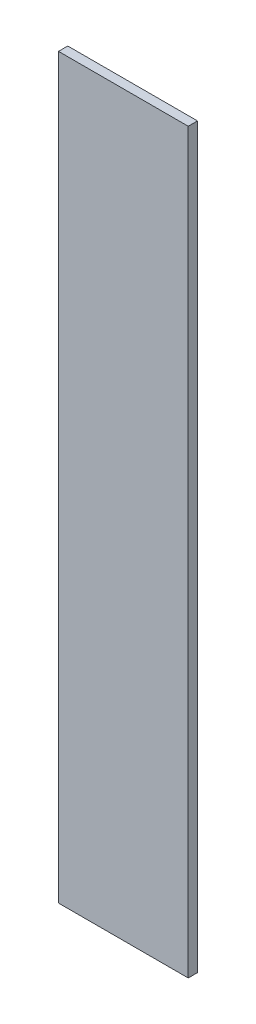
ISO-10303-21;
HEADER;
FILE_DESCRIPTION(('STEP AP214'),'2;1');
FILE_NAME('part.step','',(''),(''),'','','');
FILE_SCHEMA(('AUTOMOTIVE_DESIGN { 1 0 10303 214 1 1 1 1 }'));
ENDSEC;
DATA;
#1=APPLICATION_CONTEXT('core data for automotive mechanical design processes');
#2=APPLICATION_PROTOCOL_DEFINITION('international standard','automotive_design',2000,#1);
#3=PRODUCT_CONTEXT('',#1,'mechanical');
#4=PRODUCT('Part','Part','',(#3));
#5=PRODUCT_RELATED_PRODUCT_CATEGORY('part','',(#4));
#6=PRODUCT_DEFINITION_FORMATION('','',#4);
#7=PRODUCT_DEFINITION_CONTEXT('part definition',#1,'design');
#8=PRODUCT_DEFINITION('design','',#6,#7);
#9=PRODUCT_DEFINITION_SHAPE('','',#8);
#10=(LENGTH_UNIT() NAMED_UNIT(*) SI_UNIT(.MILLI.,.METRE.));
#11=(NAMED_UNIT(*) PLANE_ANGLE_UNIT() SI_UNIT($,.RADIAN.));
#12=(NAMED_UNIT(*) SI_UNIT($,.STERADIAN.) SOLID_ANGLE_UNIT());
#13=UNCERTAINTY_MEASURE_WITH_UNIT(LENGTH_MEASURE(1.E-05),#10,'distance_accuracy_value','');
#14=(GEOMETRIC_REPRESENTATION_CONTEXT(3) GLOBAL_UNCERTAINTY_ASSIGNED_CONTEXT((#13)) GLOBAL_UNIT_ASSIGNED_CONTEXT((#10,
#11,#12)) REPRESENTATION_CONTEXT('',''));
#15=CARTESIAN_POINT('',(0.,0.,0.));
#16=DIRECTION('',(0.,0.,1.));
#17=DIRECTION('',(1.,0.,0.));
#18=AXIS2_PLACEMENT_3D('',#15,#16,#17);
#19=CARTESIAN_POINT('',(0.,0.,6.35));
#20=DIRECTION('',(0.,1.,0.));
#21=DIRECTION('',(0.,0.,1.));
#22=AXIS2_PLACEMENT_3D('',#19,#20,#21);
#23=PLANE('',#22);
#24=DIRECTION('',(1.,0.,0.));
#25=VECTOR('',#24,1.);
#26=CARTESIAN_POINT('',(0.,0.,0.));
#27=LINE('',#26,#25);
#28=CARTESIAN_POINT('',(-88.9,0.,0.));
#29=VERTEX_POINT('',#28);
#30=CARTESIAN_POINT('',(0.,0.,0.));
#31=VERTEX_POINT('',#30);
#32=EDGE_CURVE('E113',#29,#31,#27,.T.);
#33=ORIENTED_EDGE('',*,*,#32,.T.);
#34=DIRECTION('',(0.,0.,-1.));
#35=VECTOR('',#34,1.);
#36=CARTESIAN_POINT('',(0.,0.,6.35));
#37=LINE('',#36,#35);
#38=CARTESIAN_POINT('',(0.,0.,6.35));
#39=VERTEX_POINT('',#38);
#40=EDGE_CURVE('E11',#39,#31,#37,.T.);
#41=ORIENTED_EDGE('',*,*,#40,.F.);
#42=DIRECTION('',(1.,0.,0.));
#43=VECTOR('',#42,1.);
#44=CARTESIAN_POINT('',(0.,0.,6.35));
#45=LINE('',#44,#43);
#46=CARTESIAN_POINT('',(-88.9,0.,6.35));
#47=VERTEX_POINT('',#46);
#48=EDGE_CURVE('E97',#47,#39,#45,.T.);
#49=ORIENTED_EDGE('',*,*,#48,.F.);
#50=DIRECTION('',(0.,0.,-1.));
#51=VECTOR('',#50,1.);
#52=CARTESIAN_POINT('',(-88.9,0.,6.35));
#53=LINE('',#52,#51);
#54=EDGE_CURVE('E109',#47,#29,#53,.T.);
#55=ORIENTED_EDGE('',*,*,#54,.T.);
#56=EDGE_LOOP('',(#33,#41,#49,#55));
#57=FACE_BOUND('',#56,.T.);
#58=ADVANCED_FACE('F45',(#57),#23,.F.);
#59=CARTESIAN_POINT('',(0.,0.,6.35));
#60=DIRECTION('',(-1.,0.,0.));
#61=DIRECTION('',(0.,0.,1.));
#62=AXIS2_PLACEMENT_3D('',#59,#60,#61);
#63=PLANE('',#62);
#64=DIRECTION('',(0.,1.,0.));
#65=VECTOR('',#64,1.);
#66=CARTESIAN_POINT('',(0.,0.,0.));
#67=LINE('',#66,#65);
#68=CARTESIAN_POINT('',(0.,505.46,0.));
#69=VERTEX_POINT('',#68);
#70=EDGE_CURVE('E102',#31,#69,#67,.T.);
#71=ORIENTED_EDGE('',*,*,#70,.T.);
#72=DIRECTION('',(0.,0.,-1.));
#73=VECTOR('',#72,1.);
#74=CARTESIAN_POINT('',(0.,505.46,6.35));
#75=LINE('',#74,#73);
#76=CARTESIAN_POINT('',(0.,505.46,6.35));
#77=VERTEX_POINT('',#76);
#78=EDGE_CURVE('E54',#77,#69,#75,.T.);
#79=ORIENTED_EDGE('',*,*,#78,.F.);
#80=DIRECTION('',(0.,1.,0.));
#81=VECTOR('',#80,1.);
#82=CARTESIAN_POINT('',(0.,0.,6.35));
#83=LINE('',#82,#81);
#84=EDGE_CURVE('E92',#39,#77,#83,.T.);
#85=ORIENTED_EDGE('',*,*,#84,.F.);
#86=ORIENTED_EDGE('',*,*,#40,.T.);
#87=EDGE_LOOP('',(#71,#79,#85,#86));
#88=FACE_BOUND('',#87,.T.);
#89=ADVANCED_FACE('F101',(#88),#63,.F.);
#90=CARTESIAN_POINT('',(0.,505.46,6.35));
#91=DIRECTION('',(0.,-1.,0.));
#92=DIRECTION('',(0.,0.,-1.));
#93=AXIS2_PLACEMENT_3D('',#90,#91,#92);
#94=PLANE('',#93);
#95=DIRECTION('',(-1.,0.,0.));
#96=VECTOR('',#95,1.);
#97=CARTESIAN_POINT('',(0.,505.46,0.));
#98=LINE('',#97,#96);
#99=CARTESIAN_POINT('',(-88.9,505.46,0.));
#100=VERTEX_POINT('',#99);
#101=EDGE_CURVE('E79',#69,#100,#98,.T.);
#102=ORIENTED_EDGE('',*,*,#101,.T.);
#103=DIRECTION('',(0.,0.,-1.));
#104=VECTOR('',#103,1.);
#105=CARTESIAN_POINT('',(-88.9,505.46,6.35));
#106=LINE('',#105,#104);
#107=CARTESIAN_POINT('',(-88.9,505.46,6.35));
#108=VERTEX_POINT('',#107);
#109=EDGE_CURVE('E104',#108,#100,#106,.T.);
#110=ORIENTED_EDGE('',*,*,#109,.F.);
#111=DIRECTION('',(-1.,0.,0.));
#112=VECTOR('',#111,1.);
#113=CARTESIAN_POINT('',(0.,505.46,6.35));
#114=LINE('',#113,#112);
#115=EDGE_CURVE('E95',#77,#108,#114,.T.);
#116=ORIENTED_EDGE('',*,*,#115,.F.);
#117=ORIENTED_EDGE('',*,*,#78,.T.);
#118=EDGE_LOOP('',(#102,#110,#116,#117));
#119=FACE_BOUND('',#118,.T.);
#120=ADVANCED_FACE('F105',(#119),#94,.F.);
#121=CARTESIAN_POINT('',(-88.9,0.,6.35));
#122=DIRECTION('',(1.,0.,0.));
#123=DIRECTION('',(0.,0.,-1.));
#124=AXIS2_PLACEMENT_3D('',#121,#122,#123);
#125=PLANE('',#124);
#126=DIRECTION('',(0.,-1.,0.));
#127=VECTOR('',#126,1.);
#128=CARTESIAN_POINT('',(-88.9,0.,0.));
#129=LINE('',#128,#127);
#130=EDGE_CURVE('E85',#100,#29,#129,.T.);
#131=ORIENTED_EDGE('',*,*,#130,.T.);
#132=ORIENTED_EDGE('',*,*,#54,.F.);
#133=DIRECTION('',(0.,-1.,0.));
#134=VECTOR('',#133,1.);
#135=CARTESIAN_POINT('',(-88.9,0.,6.35));
#136=LINE('',#135,#134);
#137=EDGE_CURVE('E62',#108,#47,#136,.T.);
#138=ORIENTED_EDGE('',*,*,#137,.F.);
#139=ORIENTED_EDGE('',*,*,#109,.T.);
#140=EDGE_LOOP('',(#131,#132,#138,#139));
#141=FACE_BOUND('',#140,.T.);
#142=ADVANCED_FACE('F126',(#141),#125,.F.);
#143=CARTESIAN_POINT('',(0.,0.,6.35));
#144=DIRECTION('',(0.,0.,-1.));
#145=DIRECTION('',(-1.,0.,0.));
#146=AXIS2_PLACEMENT_3D('',#143,#144,#145);
#147=PLANE('',#146);
#148=ORIENTED_EDGE('',*,*,#48,.T.);
#149=ORIENTED_EDGE('',*,*,#84,.T.);
#150=ORIENTED_EDGE('',*,*,#115,.T.);
#151=ORIENTED_EDGE('',*,*,#137,.T.);
#152=EDGE_LOOP('',(#148,#149,#150,#151));
#153=FACE_BOUND('',#152,.T.);
#154=ADVANCED_FACE('F93',(#153),#147,.F.);
#155=CARTESIAN_POINT('',(0.,0.,0.));
#156=DIRECTION('',(0.,0.,-1.));
#157=DIRECTION('',(-1.,0.,0.));
#158=AXIS2_PLACEMENT_3D('',#155,#156,#157);
#159=PLANE('',#158);
#160=ORIENTED_EDGE('',*,*,#32,.F.);
#161=ORIENTED_EDGE('',*,*,#130,.F.);
#162=ORIENTED_EDGE('',*,*,#101,.F.);
#163=ORIENTED_EDGE('',*,*,#70,.F.);
#164=EDGE_LOOP('',(#160,#161,#162,#163));
#165=FACE_BOUND('',#164,.T.);
#166=ADVANCED_FACE('F129',(#165),#159,.T.);
#167=CLOSED_SHELL('',(#58,#89,#120,#142,#154,#166));
#168=MANIFOLD_SOLID_BREP('B2',#167);
#169=ADVANCED_BREP_SHAPE_REPRESENTATION('',(#18,#168),#14);
#170=SHAPE_DEFINITION_REPRESENTATION(#9,#169);
ENDSEC;
END-ISO-10303-21;
